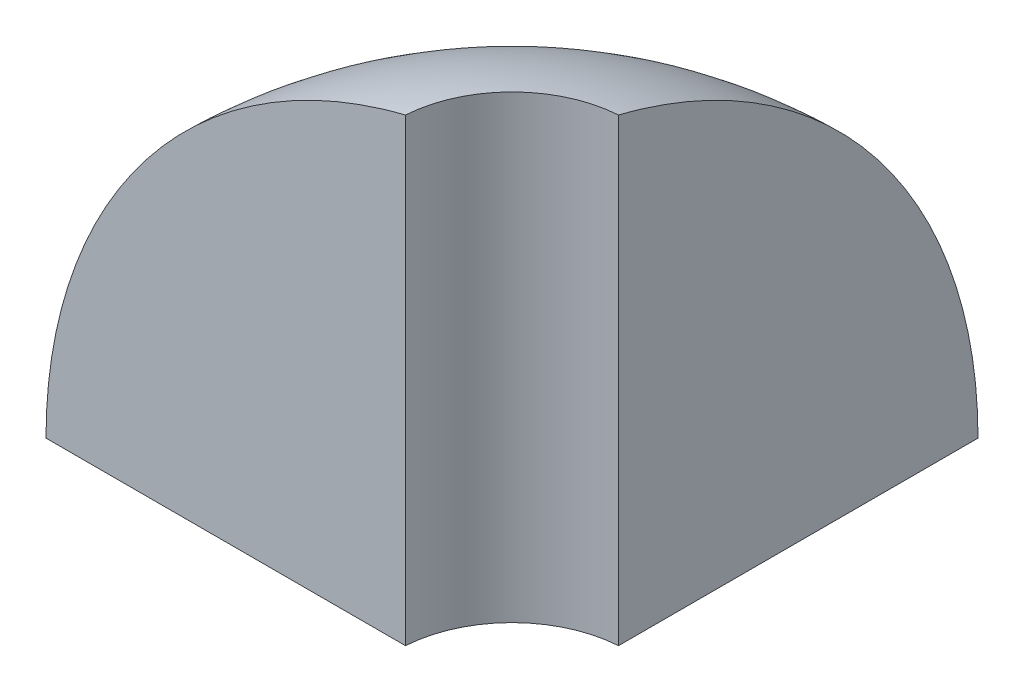
ISO-10303-21;
HEADER;
FILE_DESCRIPTION(('STEP AP214'),'2;1');
FILE_NAME('part.step','',(''),(''),'','','');
FILE_SCHEMA(('AUTOMOTIVE_DESIGN { 1 0 10303 214 1 1 1 1 }'));
ENDSEC;
DATA;
#1=APPLICATION_CONTEXT('core data for automotive mechanical design processes');
#2=APPLICATION_PROTOCOL_DEFINITION('international standard','automotive_design',2000,#1);
#3=PRODUCT_CONTEXT('',#1,'mechanical');
#4=PRODUCT('Part','Part','',(#3));
#5=PRODUCT_RELATED_PRODUCT_CATEGORY('part','',(#4));
#6=PRODUCT_DEFINITION_FORMATION('','',#4);
#7=PRODUCT_DEFINITION_CONTEXT('part definition',#1,'design');
#8=PRODUCT_DEFINITION('design','',#6,#7);
#9=PRODUCT_DEFINITION_SHAPE('','',#8);
#10=(LENGTH_UNIT() NAMED_UNIT(*) SI_UNIT(.MILLI.,.METRE.));
#11=(NAMED_UNIT(*) PLANE_ANGLE_UNIT() SI_UNIT($,.RADIAN.));
#12=(NAMED_UNIT(*) SI_UNIT($,.STERADIAN.) SOLID_ANGLE_UNIT());
#13=UNCERTAINTY_MEASURE_WITH_UNIT(LENGTH_MEASURE(1.E-05),#10,'distance_accuracy_value','');
#14=(GEOMETRIC_REPRESENTATION_CONTEXT(3) GLOBAL_UNCERTAINTY_ASSIGNED_CONTEXT((#13)) GLOBAL_UNIT_ASSIGNED_CONTEXT((#10,
#11,#12)) REPRESENTATION_CONTEXT('',''));
#15=CARTESIAN_POINT('',(0.,0.,0.));
#16=DIRECTION('',(0.,0.,1.));
#17=DIRECTION('',(1.,0.,0.));
#18=AXIS2_PLACEMENT_3D('',#15,#16,#17);
#19=CARTESIAN_POINT('',(0.,0.,0.));
#20=DIRECTION('',(0.,1.,0.));
#21=DIRECTION('',(1.,0.,0.));
#22=AXIS2_PLACEMENT_3D('',#19,#20,#21);
#23=SPHERICAL_SURFACE('',#22,31.5);
#24=CARTESIAN_POINT('',(0.,30.5694291736041,0.));
#25=DIRECTION('',(0.,-1.,0.));
#26=DIRECTION('',(0.,0.,-1.));
#27=AXIS2_PLACEMENT_3D('',#24,#25,#26);
#28=CIRCLE('',#27,7.6);
#29=CARTESIAN_POINT('',(-0.499999999999999,30.5694291736041,-7.58353479585872));
#30=VERTEX_POINT('',#29);
#31=CARTESIAN_POINT('',(-7.58353479585872,30.5694291736041,-0.499999999999999));
#32=VERTEX_POINT('',#31);
#33=EDGE_CURVE('E78',#30,#32,#28,.F.);
#34=ORIENTED_EDGE('',*,*,#33,.F.);
#35=CARTESIAN_POINT('',(-0.499999999999998,0.,0.));
#36=DIRECTION('',(-1.,0.,0.));
#37=DIRECTION('',(0.,0.,1.));
#38=AXIS2_PLACEMENT_3D('',#35,#36,#37);
#39=CIRCLE('',#38,31.4960314960472);
#40=CARTESIAN_POINT('',(-0.500000000000002,0.,-31.4960314960472));
#41=VERTEX_POINT('',#40);
#42=EDGE_CURVE('E41',#41,#30,#39,.F.);
#43=ORIENTED_EDGE('',*,*,#42,.F.);
#44=CARTESIAN_POINT('',(0.,0.,0.));
#45=DIRECTION('',(0.,1.,0.));
#46=DIRECTION('',(0.,0.,1.));
#47=AXIS2_PLACEMENT_3D('',#44,#45,#46);
#48=CIRCLE('',#47,31.5);
#49=CARTESIAN_POINT('',(-31.4960314960472,0.,-0.499999999999996));
#50=VERTEX_POINT('',#49);
#51=EDGE_CURVE('E56',#50,#41,#48,.F.);
#52=ORIENTED_EDGE('',*,*,#51,.F.);
#53=CARTESIAN_POINT('',(0.,0.,-0.5));
#54=DIRECTION('',(0.,0.,-1.));
#55=DIRECTION('',(-1.,0.,0.));
#56=AXIS2_PLACEMENT_3D('',#53,#54,#55);
#57=CIRCLE('',#56,31.4960314960472);
#58=EDGE_CURVE('E11',#32,#50,#57,.F.);
#59=ORIENTED_EDGE('',*,*,#58,.F.);
#60=EDGE_LOOP('',(#34,#43,#52,#59));
#61=FACE_BOUND('',#60,.T.);
#62=ADVANCED_FACE('F34',(#61),#23,.T.);
#63=CARTESIAN_POINT('',(-0.499999999999998,-31.5,-0.5));
#64=DIRECTION('',(0.,0.,-1.));
#65=DIRECTION('',(-1.,0.,0.));
#66=AXIS2_PLACEMENT_3D('',#63,#64,#65);
#67=PLANE('',#66);
#68=DIRECTION('',(1.,0.,0.));
#69=VECTOR('',#68,1.);
#70=CARTESIAN_POINT('',(-0.499999999999998,0.,-0.5));
#71=LINE('',#70,#69);
#72=CARTESIAN_POINT('',(-7.58353479585872,0.,-0.499999999999999));
#73=VERTEX_POINT('',#72);
#74=EDGE_CURVE('E81',#50,#73,#71,.T.);
#75=ORIENTED_EDGE('',*,*,#74,.T.);
#76=DIRECTION('',(0.,-1.,0.));
#77=VECTOR('',#76,1.);
#78=CARTESIAN_POINT('',(-7.58353479585872,31.4920624919995,-0.499999999999999));
#79=LINE('',#78,#77);
#80=EDGE_CURVE('E48',#73,#32,#79,.F.);
#81=ORIENTED_EDGE('',*,*,#80,.T.);
#82=ORIENTED_EDGE('',*,*,#58,.T.);
#83=EDGE_LOOP('',(#75,#81,#82));
#84=FACE_BOUND('',#83,.T.);
#85=ADVANCED_FACE('F90',(#84),#67,.F.);
#86=CARTESIAN_POINT('',(-0.500000000000002,-31.5,-31.4960314960472));
#87=DIRECTION('',(-1.,0.,0.));
#88=DIRECTION('',(0.,0.,1.));
#89=AXIS2_PLACEMENT_3D('',#86,#87,#88);
#90=PLANE('',#89);
#91=ORIENTED_EDGE('',*,*,#42,.T.);
#92=DIRECTION('',(0.,-1.,0.));
#93=VECTOR('',#92,1.);
#94=CARTESIAN_POINT('',(-0.499999999999999,31.4920624919995,-7.58353479585872));
#95=LINE('',#94,#93);
#96=CARTESIAN_POINT('',(-0.499999999999999,0.,-7.58353479585872));
#97=VERTEX_POINT('',#96);
#98=EDGE_CURVE('E69',#30,#97,#95,.T.);
#99=ORIENTED_EDGE('',*,*,#98,.T.);
#100=DIRECTION('',(0.,0.,1.));
#101=VECTOR('',#100,1.);
#102=CARTESIAN_POINT('',(-0.499999999999998,0.,0.));
#103=LINE('',#102,#101);
#104=EDGE_CURVE('E76',#41,#97,#103,.T.);
#105=ORIENTED_EDGE('',*,*,#104,.F.);
#106=EDGE_LOOP('',(#91,#99,#105));
#107=FACE_BOUND('',#106,.T.);
#108=ADVANCED_FACE('F75',(#107),#90,.F.);
#109=CARTESIAN_POINT('',(-31.4960314960472,0.,0.));
#110=DIRECTION('',(0.,1.,0.));
#111=DIRECTION('',(0.,0.,1.));
#112=AXIS2_PLACEMENT_3D('',#109,#110,#111);
#113=PLANE('',#112);
#114=ORIENTED_EDGE('',*,*,#104,.T.);
#115=CARTESIAN_POINT('',(0.,0.,0.));
#116=DIRECTION('',(0.,-1.,0.));
#117=DIRECTION('',(0.,0.,-1.));
#118=AXIS2_PLACEMENT_3D('',#115,#116,#117);
#119=CIRCLE('',#118,7.6);
#120=EDGE_CURVE('E66',#73,#97,#119,.T.);
#121=ORIENTED_EDGE('',*,*,#120,.F.);
#122=ORIENTED_EDGE('',*,*,#74,.F.);
#123=ORIENTED_EDGE('',*,*,#51,.T.);
#124=EDGE_LOOP('',(#114,#121,#122,#123));
#125=FACE_BOUND('',#124,.T.);
#126=ADVANCED_FACE('F80',(#125),#113,.F.);
#127=CARTESIAN_POINT('',(0.,31.4920624919995,0.));
#128=DIRECTION('',(0.,-1.,0.));
#129=DIRECTION('',(0.,0.,-1.));
#130=AXIS2_PLACEMENT_3D('',#127,#128,#129);
#131=CYLINDRICAL_SURFACE('',#130,7.6);
#132=ORIENTED_EDGE('',*,*,#120,.T.);
#133=ORIENTED_EDGE('',*,*,#98,.F.);
#134=ORIENTED_EDGE('',*,*,#33,.T.);
#135=ORIENTED_EDGE('',*,*,#80,.F.);
#136=EDGE_LOOP('',(#132,#133,#134,#135));
#137=FACE_BOUND('',#136,.T.);
#138=ADVANCED_FACE('F68',(#137),#131,.F.);
#139=CLOSED_SHELL('',(#62,#85,#108,#126,#138));
#140=MANIFOLD_SOLID_BREP('B2',#139);
#141=ADVANCED_BREP_SHAPE_REPRESENTATION('',(#18,#140),#14);
#142=SHAPE_DEFINITION_REPRESENTATION(#9,#141);
ENDSEC;
END-ISO-10303-21;
